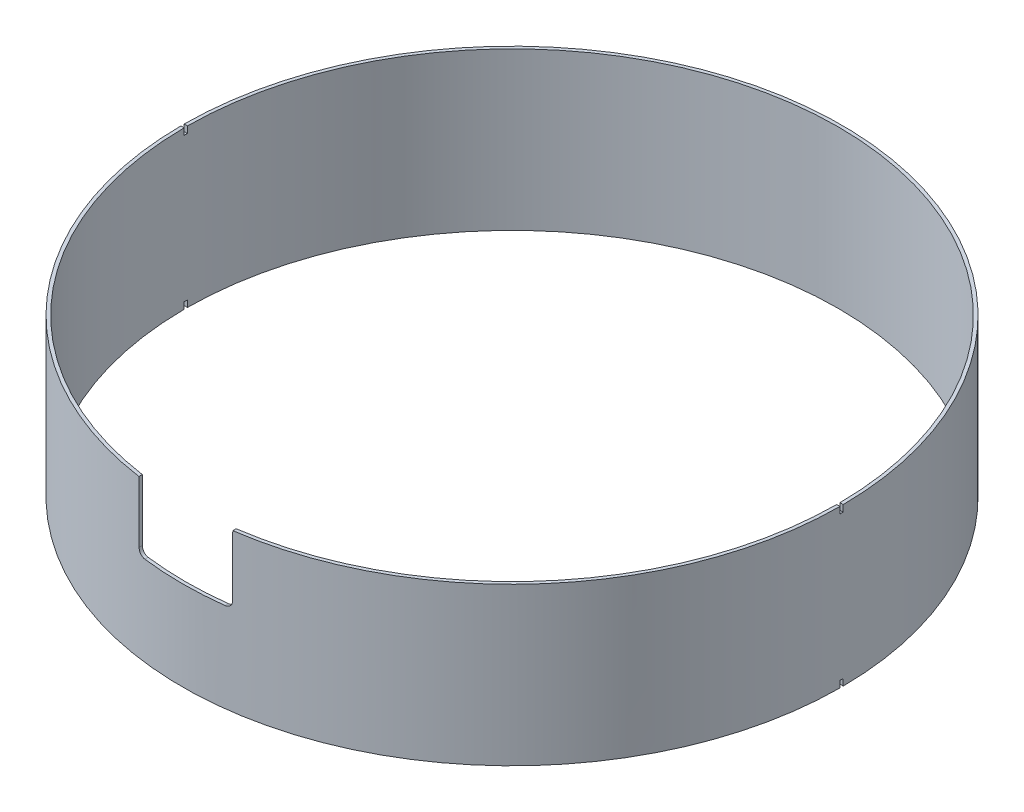
ISO-10303-21;
HEADER;
FILE_DESCRIPTION(('STEP AP214'),'2;1');
FILE_NAME('part.step','',(''),(''),'','','');
FILE_SCHEMA(('AUTOMOTIVE_DESIGN { 1 0 10303 214 1 1 1 1 }'));
ENDSEC;
DATA;
#1=APPLICATION_CONTEXT('core data for automotive mechanical design processes');
#2=APPLICATION_PROTOCOL_DEFINITION('international standard','automotive_design',2000,#1);
#3=PRODUCT_CONTEXT('',#1,'mechanical');
#4=PRODUCT('Part','Part','',(#3));
#5=PRODUCT_RELATED_PRODUCT_CATEGORY('part','',(#4));
#6=PRODUCT_DEFINITION_FORMATION('','',#4);
#7=PRODUCT_DEFINITION_CONTEXT('part definition',#1,'design');
#8=PRODUCT_DEFINITION('design','',#6,#7);
#9=PRODUCT_DEFINITION_SHAPE('','',#8);
#10=(LENGTH_UNIT() NAMED_UNIT(*) SI_UNIT(.MILLI.,.METRE.));
#11=(NAMED_UNIT(*) PLANE_ANGLE_UNIT() SI_UNIT($,.RADIAN.));
#12=(NAMED_UNIT(*) SI_UNIT($,.STERADIAN.) SOLID_ANGLE_UNIT());
#13=UNCERTAINTY_MEASURE_WITH_UNIT(LENGTH_MEASURE(1.E-05),#10,'distance_accuracy_value','');
#14=(GEOMETRIC_REPRESENTATION_CONTEXT(3) GLOBAL_UNCERTAINTY_ASSIGNED_CONTEXT((#13)) GLOBAL_UNIT_ASSIGNED_CONTEXT((#10,
#11,#12)) REPRESENTATION_CONTEXT('',''));
#15=CARTESIAN_POINT('',(0.,0.,0.));
#16=DIRECTION('',(0.,0.,1.));
#17=DIRECTION('',(1.,0.,0.));
#18=AXIS2_PLACEMENT_3D('',#15,#16,#17);
#19=CARTESIAN_POINT('',(0.,24.,0.));
#20=DIRECTION('',(0.,1.,0.));
#21=DIRECTION('',(0.,0.,1.));
#22=AXIS2_PLACEMENT_3D('',#19,#20,#21);
#23=PLANE('',#22);
#24=CARTESIAN_POINT('',(0.,24.,0.));
#25=DIRECTION('',(0.,1.,0.));
#26=DIRECTION('',(0.,0.,1.));
#27=AXIS2_PLACEMENT_3D('',#24,#25,#26);
#28=CIRCLE('',#27,50.3);
#29=CARTESIAN_POINT('',(7.15883579523689,24.,49.7879610955986));
#30=VERTEX_POINT('',#29);
#31=CARTESIAN_POINT('',(50.2993787237974,24.,0.25));
#32=VERTEX_POINT('',#31);
#33=EDGE_CURVE('E262',#30,#32,#28,.T.);
#34=ORIENTED_EDGE('',*,*,#33,.T.);
#35=DIRECTION('',(-1.,0.,0.));
#36=VECTOR('',#35,1.);
#37=CARTESIAN_POINT('',(52.,24.,0.25));
#38=LINE('',#37,#36);
#39=CARTESIAN_POINT('',(49.7993724860063,24.,0.25));
#40=VERTEX_POINT('',#39);
#41=EDGE_CURVE('E357',#32,#40,#38,.T.);
#42=ORIENTED_EDGE('',*,*,#41,.T.);
#43=CARTESIAN_POINT('',(0.,24.,0.));
#44=DIRECTION('',(0.,1.,0.));
#45=DIRECTION('',(0.,0.,1.));
#46=AXIS2_PLACEMENT_3D('',#43,#44,#45);
#47=CIRCLE('',#46,49.8);
#48=CARTESIAN_POINT('',(7.15883579523689,24.,49.2827664610747));
#49=VERTEX_POINT('',#48);
#50=EDGE_CURVE('E254',#49,#40,#47,.T.);
#51=ORIENTED_EDGE('',*,*,#50,.F.);
#52=DIRECTION('',(0.,0.,-1.));
#53=VECTOR('',#52,1.);
#54=CARTESIAN_POINT('',(7.15883579523689,24.,52.));
#55=LINE('',#54,#53);
#56=EDGE_CURVE('E240',#30,#49,#55,.T.);
#57=ORIENTED_EDGE('',*,*,#56,.F.);
#58=EDGE_LOOP('',(#34,#42,#51,#57));
#59=FACE_BOUND('',#58,.T.);
#60=ADVANCED_FACE('F33',(#59),#23,.T.);
#61=CARTESIAN_POINT('',(-49.7993724860063,24.,0.25));
#62=VERTEX_POINT('',#61);
#63=CARTESIAN_POINT('',(-7.15883579523689,24.,49.2827664610748));
#64=VERTEX_POINT('',#63);
#65=EDGE_CURVE('E258',#62,#64,#47,.T.);
#66=ORIENTED_EDGE('',*,*,#65,.F.);
#67=CARTESIAN_POINT('',(-50.2993787237974,24.,0.25));
#68=VERTEX_POINT('',#67);
#69=EDGE_CURVE('E366',#62,#68,#38,.T.);
#70=ORIENTED_EDGE('',*,*,#69,.T.);
#71=CARTESIAN_POINT('',(-7.15883579523689,24.,49.7879610955986));
#72=VERTEX_POINT('',#71);
#73=EDGE_CURVE('E267',#68,#72,#28,.T.);
#74=ORIENTED_EDGE('',*,*,#73,.T.);
#75=DIRECTION('',(0.,0.,-1.));
#76=VECTOR('',#75,1.);
#77=CARTESIAN_POINT('',(-7.15883579523689,24.,52.));
#78=LINE('',#77,#76);
#79=EDGE_CURVE('E243',#72,#64,#78,.T.);
#80=ORIENTED_EDGE('',*,*,#79,.T.);
#81=EDGE_LOOP('',(#66,#70,#74,#80));
#82=FACE_BOUND('',#81,.T.);
#83=ADVANCED_FACE('F422',(#82),#23,.T.);
#84=CARTESIAN_POINT('',(50.2993787237974,24.,-0.25));
#85=VERTEX_POINT('',#84);
#86=CARTESIAN_POINT('',(-50.2993787237974,24.,-0.25));
#87=VERTEX_POINT('',#86);
#88=EDGE_CURVE('E266',#85,#87,#28,.T.);
#89=ORIENTED_EDGE('',*,*,#88,.T.);
#90=DIRECTION('',(-1.,0.,0.));
#91=VECTOR('',#90,1.);
#92=CARTESIAN_POINT('',(52.,24.,-0.25));
#93=LINE('',#92,#91);
#94=CARTESIAN_POINT('',(-49.7993724860063,24.,-0.25));
#95=VERTEX_POINT('',#94);
#96=EDGE_CURVE('E414',#95,#87,#93,.T.);
#97=ORIENTED_EDGE('',*,*,#96,.F.);
#98=CARTESIAN_POINT('',(49.7993724860063,24.,-0.25));
#99=VERTEX_POINT('',#98);
#100=EDGE_CURVE('E257',#99,#95,#47,.T.);
#101=ORIENTED_EDGE('',*,*,#100,.F.);
#102=EDGE_CURVE('E412',#85,#99,#93,.T.);
#103=ORIENTED_EDGE('',*,*,#102,.F.);
#104=EDGE_LOOP('',(#89,#97,#101,#103));
#105=FACE_BOUND('',#104,.T.);
#106=ADVANCED_FACE('F411',(#105),#23,.T.);
#107=CARTESIAN_POINT('',(0.,24.,0.));
#108=DIRECTION('',(0.,-1.,0.));
#109=DIRECTION('',(0.,0.,-1.));
#110=AXIS2_PLACEMENT_3D('',#107,#108,#109);
#111=CYLINDRICAL_SURFACE('',#110,50.3);
#112=DIRECTION('',(0.,-1.,0.));
#113=VECTOR('',#112,1.);
#114=CARTESIAN_POINT('',(50.2993787237974,24.,-0.25));
#115=LINE('',#114,#113);
#116=CARTESIAN_POINT('',(50.2993787237974,0.,-0.25));
#117=VERTEX_POINT('',#116);
#118=CARTESIAN_POINT('',(50.2993787237974,1.00000000000001,-0.25));
#119=VERTEX_POINT('',#118);
#120=EDGE_CURVE('E226',#117,#119,#115,.F.);
#121=ORIENTED_EDGE('',*,*,#120,.F.);
#122=CARTESIAN_POINT('',(0.,0.,0.));
#123=DIRECTION('',(0.,1.,0.));
#124=DIRECTION('',(0.,0.,1.));
#125=AXIS2_PLACEMENT_3D('',#122,#123,#124);
#126=CIRCLE('',#125,50.3);
#127=CARTESIAN_POINT('',(-50.2993787237973,0.,-0.25));
#128=VERTEX_POINT('',#127);
#129=EDGE_CURVE('E269',#117,#128,#126,.T.);
#130=ORIENTED_EDGE('',*,*,#129,.T.);
#131=DIRECTION('',(0.,-1.,0.));
#132=VECTOR('',#131,1.);
#133=CARTESIAN_POINT('',(-50.2993787237974,24.,-0.25));
#134=LINE('',#133,#132);
#135=CARTESIAN_POINT('',(-50.2993787237974,1.00000000000001,-0.25));
#136=VERTEX_POINT('',#135);
#137=EDGE_CURVE('E228',#136,#128,#134,.T.);
#138=ORIENTED_EDGE('',*,*,#137,.F.);
#139=CARTESIAN_POINT('',(0.,1.00000000000001,0.));
#140=DIRECTION('',(0.,-1.,0.));
#141=DIRECTION('',(0.,0.,-1.));
#142=AXIS2_PLACEMENT_3D('',#139,#140,#141);
#143=CIRCLE('',#142,50.3);
#144=CARTESIAN_POINT('',(-50.2993787237973,1.00000000000001,0.25));
#145=VERTEX_POINT('',#144);
#146=EDGE_CURVE('E199',#145,#136,#143,.T.);
#147=ORIENTED_EDGE('',*,*,#146,.F.);
#148=DIRECTION('',(0.,-1.,0.));
#149=VECTOR('',#148,1.);
#150=CARTESIAN_POINT('',(-50.2993787237974,24.,0.25));
#151=LINE('',#150,#149);
#152=CARTESIAN_POINT('',(-50.2993787237973,0.,0.25));
#153=VERTEX_POINT('',#152);
#154=EDGE_CURVE('E216',#153,#145,#151,.F.);
#155=ORIENTED_EDGE('',*,*,#154,.F.);
#156=CARTESIAN_POINT('',(50.2993787237974,0.,0.25));
#157=VERTEX_POINT('',#156);
#158=EDGE_CURVE('E214',#153,#157,#126,.T.);
#159=ORIENTED_EDGE('',*,*,#158,.T.);
#160=DIRECTION('',(0.,-1.,0.));
#161=VECTOR('',#160,1.);
#162=CARTESIAN_POINT('',(50.2993787237974,24.,0.25));
#163=LINE('',#162,#161);
#164=CARTESIAN_POINT('',(50.2993787237974,1.00000000000001,0.25));
#165=VERTEX_POINT('',#164);
#166=EDGE_CURVE('E203',#165,#157,#163,.T.);
#167=ORIENTED_EDGE('',*,*,#166,.F.);
#168=EDGE_CURVE('E188',#119,#165,#143,.T.);
#169=ORIENTED_EDGE('',*,*,#168,.F.);
#170=EDGE_LOOP('',(#121,#130,#138,#147,#155,#159,#167,#169));
#171=FACE_BOUND('',#170,.T.);
#172=DIRECTION('',(0.,-1.,0.));
#173=VECTOR('',#172,1.);
#174=CARTESIAN_POINT('',(-50.2993787237974,24.,0.25));
#175=LINE('',#174,#173);
#176=CARTESIAN_POINT('',(-50.2993787237974,23.,0.25));
#177=VERTEX_POINT('',#176);
#178=EDGE_CURVE('E236',#177,#68,#175,.F.);
#179=ORIENTED_EDGE('',*,*,#178,.F.);
#180=CARTESIAN_POINT('',(0.,23.,0.));
#181=DIRECTION('',(0.,1.,0.));
#182=DIRECTION('',(0.,0.,1.));
#183=AXIS2_PLACEMENT_3D('',#180,#181,#182);
#184=CIRCLE('',#183,50.3);
#185=CARTESIAN_POINT('',(-50.2993787237973,23.,-0.25));
#186=VERTEX_POINT('',#185);
#187=EDGE_CURVE('E233',#186,#177,#184,.T.);
#188=ORIENTED_EDGE('',*,*,#187,.F.);
#189=DIRECTION('',(0.,-1.,0.));
#190=VECTOR('',#189,1.);
#191=CARTESIAN_POINT('',(-50.2993787237974,24.,-0.25));
#192=LINE('',#191,#190);
#193=EDGE_CURVE('E231',#87,#186,#192,.T.);
#194=ORIENTED_EDGE('',*,*,#193,.F.);
#195=ORIENTED_EDGE('',*,*,#88,.F.);
#196=DIRECTION('',(0.,-1.,0.));
#197=VECTOR('',#196,1.);
#198=CARTESIAN_POINT('',(50.2993787237974,24.,-0.25));
#199=LINE('',#198,#197);
#200=CARTESIAN_POINT('',(50.2993787237974,23.,-0.25));
#201=VERTEX_POINT('',#200);
#202=EDGE_CURVE('E198',#201,#85,#199,.F.);
#203=ORIENTED_EDGE('',*,*,#202,.F.);
#204=CARTESIAN_POINT('',(50.2993787237974,23.,0.25));
#205=VERTEX_POINT('',#204);
#206=EDGE_CURVE('E235',#205,#201,#184,.T.);
#207=ORIENTED_EDGE('',*,*,#206,.F.);
#208=DIRECTION('',(0.,-1.,0.));
#209=VECTOR('',#208,1.);
#210=CARTESIAN_POINT('',(50.2993787237974,24.,0.25));
#211=LINE('',#210,#209);
#212=EDGE_CURVE('E238',#32,#205,#211,.T.);
#213=ORIENTED_EDGE('',*,*,#212,.F.);
#214=ORIENTED_EDGE('',*,*,#33,.F.);
#215=CARTESIAN_POINT('',(0.,-2563.5000000009,0.));
#216=DIRECTION('',(-0.999996172708014,0.00276668923527711,0.));
#217=DIRECTION('',(-0.00276668923527711,-0.999996172708014,0.));
#218=AXIS2_PLACEMENT_3D('',#215,#216,#217);
#219=ELLIPSE('',#218,18180.5745866366,50.3);
#220=CARTESIAN_POINT('',(7.13295949728158,14.6472333107663,49.791674894606));
#221=VERTEX_POINT('',#220);
#222=EDGE_CURVE('E246',#221,#30,#219,.T.);
#223=ORIENTED_EDGE('',*,*,#222,.F.);
#224=CARTESIAN_POINT('',(7.13295949728158,14.6472333107647,49.791674894606));
#225=CARTESIAN_POINT('',(7.13288216838157,14.6192953652032,49.7916858359364));
#226=CARTESIAN_POINT('',(7.13163339942542,14.5913741967739,49.7918648810998));
#227=CARTESIAN_POINT('',(7.12680686770671,14.5357400547111,49.7925559946084));
#228=CARTESIAN_POINT('',(7.12322927029838,14.5080270664375,49.7930680393096));
#229=CARTESIAN_POINT('',(7.10904229938948,14.425563892205,49.7950962895735));
#230=CARTESIAN_POINT('',(7.09497831952542,14.371378977348,49.7971046813568));
#231=CARTESIAN_POINT('',(7.05805132663608,14.2661693018495,49.8023519026614));
#232=CARTESIAN_POINT('',(7.03518507642578,14.2151457118633,49.8055911848581));
#233=CARTESIAN_POINT('',(6.98132971377967,14.1176722159745,49.8131686608679));
#234=CARTESIAN_POINT('',(6.95034130205242,14.071221916004,49.8175067598836));
#235=CARTESIAN_POINT('',(6.88097200401484,13.983962959591,49.8271357063443));
#236=CARTESIAN_POINT('',(6.84255622488127,13.9431825587393,49.8324310428164));
#237=CARTESIAN_POINT('',(6.75951958640089,13.8686288051904,49.843762371775));
#238=CARTESIAN_POINT('',(6.71489733158593,13.8348570325853,49.8497985307926));
#239=CARTESIAN_POINT('',(6.62026697521863,13.7749562530851,49.86245444279));
#240=CARTESIAN_POINT('',(6.5702119674544,13.7489024768214,49.8690791711551));
#241=CARTESIAN_POINT('',(6.46648427141302,13.7055856042272,49.882635356416));
#242=CARTESIAN_POINT('',(6.41281343553415,13.6883180448956,49.8895666556388));
#243=CARTESIAN_POINT('',(6.3212015513518,13.6671449265106,49.9012404442117));
#244=CARTESIAN_POINT('',(6.28382018335256,13.6607202824872,49.9059618301));
#245=CARTESIAN_POINT('',(6.20862052842333,13.6521482732698,49.9153731891362));
#246=CARTESIAN_POINT('',(6.17080292948257,13.6499949086165,49.9200631971099));
#247=CARTESIAN_POINT('',(6.13296332457356,13.65,49.9247109241449));
#248=B_SPLINE_CURVE_WITH_KNOTS('',3,(#224,#225,#226,#227,#228,#229,#230,#231,#232,#233,#234,
#235,#236,#237,#238,#239,#240,#241,#242,#243,#244,#245,#246,#247),.UNSPECIFIED.,.F.,.F.,(4,2,2,
2,2,2,2,2,2,2,2,4),(0.,0.0837623990760629,0.167518851403592,0.334704437673014,0.501951568125108,
0.66918427471437,0.837222595765029,1.00529875992398,1.174963052879,1.34454107778872,
1.45898076738421,1.57325960030106),.UNSPECIFIED.);
#249=CARTESIAN_POINT('',(6.13296332457356,13.65,49.9247109241449));
#250=VERTEX_POINT('',#249);
#251=EDGE_CURVE('E318',#221,#250,#248,.T.);
#252=ORIENTED_EDGE('',*,*,#251,.T.);
#253=CARTESIAN_POINT('',(0.,13.65,0.));
#254=DIRECTION('',(0.,1.,0.));
#255=DIRECTION('',(0.,0.,1.));
#256=AXIS2_PLACEMENT_3D('',#253,#254,#255);
#257=CIRCLE('',#256,50.3);
#258=CARTESIAN_POINT('',(-6.13296332457355,13.65,49.9247109241449));
#259=VERTEX_POINT('',#258);
#260=EDGE_CURVE('E248',#259,#250,#257,.T.);
#261=ORIENTED_EDGE('',*,*,#260,.F.);
#262=CARTESIAN_POINT('',(-6.13296332457355,13.65,49.9247109241449));
#263=CARTESIAN_POINT('',(-6.189614730399,13.6499541673621,49.9177553940837));
#264=CARTESIAN_POINT('',(-6.24623963685681,13.6548113054868,49.9106978062792));
#265=CARTESIAN_POINT('',(-6.35783403805967,13.6739818001132,49.8966031638031));
#266=CARTESIAN_POINT('',(-6.41280452100273,13.6882893896935,49.8895660992365));
#267=CARTESIAN_POINT('',(-6.51958735558045,13.7260213177617,49.8757246605314));
#268=CARTESIAN_POINT('',(-6.57139810806658,13.749450229008,49.8689204049703));
#269=CARTESIAN_POINT('',(-6.67034476276868,13.8047597771978,49.8557818796779));
#270=CARTESIAN_POINT('',(-6.71748165874823,13.8366386121859,49.849447510111));
#271=CARTESIAN_POINT('',(-6.80562316727822,13.9078862040343,49.8374906304888));
#272=CARTESIAN_POINT('',(-6.8466422016458,13.9472368327165,49.8318664512437));
#273=CARTESIAN_POINT('',(-6.92148772006539,14.0323899898594,49.8215258565981));
#274=CARTESIAN_POINT('',(-6.95531292486671,14.0781936634366,49.8168096026645));
#275=CARTESIAN_POINT('',(-7.01451552394915,14.1745628948156,49.8085079281193));
#276=CARTESIAN_POINT('',(-7.03995639854038,14.2250887683362,49.8049140212922));
#277=CARTESIAN_POINT('',(-7.08197055973289,14.3297516112531,49.7989572841969));
#278=CARTESIAN_POINT('',(-7.09855045589779,14.3838858551041,49.7965935363656));
#279=CARTESIAN_POINT('',(-7.11783636776546,14.473215447964,49.7938395780496));
#280=CARTESIAN_POINT('',(-7.12341956838367,14.507803599874,49.7930408532697));
#281=CARTESIAN_POINT('',(-7.13093190505234,14.5773319830695,49.7919653683706));
#282=CARTESIAN_POINT('',(-7.13286628845584,14.6122716360015,49.791687858696));
#283=CARTESIAN_POINT('',(-7.13295949728156,14.6472333107647,49.791674894606));
#284=B_SPLINE_CURVE_WITH_KNOTS('',3,(#262,#263,#264,#265,#266,#267,#268,#269,#270,#271,#272,
#273,#274,#275,#276,#277,#278,#279,#280,#281,#282,#283),.UNSPECIFIED.,.F.,.F.,(4,2,2,2,2,2,2,2,
2,2,4),(0.,0.171004630869715,0.341905006369904,0.512891169274745,0.68384089848964,
0.854381047484181,1.02495149765873,1.19419913549601,1.36332035164202,1.46827472701164,
1.57307805239683),.UNSPECIFIED.);
#285=CARTESIAN_POINT('',(-7.13295949728156,14.6472333107637,49.791674894606));
#286=VERTEX_POINT('',#285);
#287=EDGE_CURVE('E11',#259,#286,#284,.T.);
#288=ORIENTED_EDGE('',*,*,#287,.T.);
#289=CARTESIAN_POINT('',(0.,-2563.49999999996,0.));
#290=DIRECTION('',(0.999996172708014,0.00276668923527812,0.));
#291=DIRECTION('',(0.00276668923527812,-0.999996172708014,0.));
#292=AXIS2_PLACEMENT_3D('',#289,#290,#291);
#293=ELLIPSE('',#292,18180.5745866299,50.3);
#294=EDGE_CURVE('E251',#72,#286,#293,.T.);
#295=ORIENTED_EDGE('',*,*,#294,.F.);
#296=ORIENTED_EDGE('',*,*,#73,.F.);
#297=EDGE_LOOP('',(#179,#188,#194,#195,#203,#207,#213,#214,#223,#252,#261,#288,#295,#296));
#298=FACE_BOUND('',#297,.T.);
#299=ADVANCED_FACE('F211',(#171,#298),#111,.T.);
#300=CARTESIAN_POINT('',(0.,24.,0.));
#301=DIRECTION('',(0.,-1.,0.));
#302=DIRECTION('',(0.,0.,-1.));
#303=AXIS2_PLACEMENT_3D('',#300,#301,#302);
#304=CYLINDRICAL_SURFACE('',#303,49.8);
#305=CARTESIAN_POINT('',(0.,0.,0.));
#306=DIRECTION('',(0.,1.,0.));
#307=DIRECTION('',(0.,0.,1.));
#308=AXIS2_PLACEMENT_3D('',#305,#306,#307);
#309=CIRCLE('',#308,49.8);
#310=CARTESIAN_POINT('',(49.7993724860063,0.,-0.25));
#311=VERTEX_POINT('',#310);
#312=CARTESIAN_POINT('',(-49.7993724860062,0.,-0.25));
#313=VERTEX_POINT('',#312);
#314=EDGE_CURVE('E261',#311,#313,#309,.T.);
#315=ORIENTED_EDGE('',*,*,#314,.F.);
#316=DIRECTION('',(0.,-1.,0.));
#317=VECTOR('',#316,1.);
#318=CARTESIAN_POINT('',(49.7993724860063,24.,-0.25));
#319=LINE('',#318,#317);
#320=CARTESIAN_POINT('',(49.7993724860063,1.00000000000001,-0.25));
#321=VERTEX_POINT('',#320);
#322=EDGE_CURVE('E215',#311,#321,#319,.F.);
#323=ORIENTED_EDGE('',*,*,#322,.T.);
#324=CARTESIAN_POINT('',(0.,1.00000000000001,0.));
#325=DIRECTION('',(0.,-1.,0.));
#326=DIRECTION('',(0.,0.,-1.));
#327=AXIS2_PLACEMENT_3D('',#324,#325,#326);
#328=CIRCLE('',#327,49.8);
#329=CARTESIAN_POINT('',(49.7993724860063,1.00000000000001,0.25));
#330=VERTEX_POINT('',#329);
#331=EDGE_CURVE('E286',#321,#330,#328,.T.);
#332=ORIENTED_EDGE('',*,*,#331,.T.);
#333=DIRECTION('',(0.,-1.,0.));
#334=VECTOR('',#333,1.);
#335=CARTESIAN_POINT('',(49.7993724860063,24.,0.25));
#336=LINE('',#335,#334);
#337=CARTESIAN_POINT('',(49.7993724860063,0.,0.25));
#338=VERTEX_POINT('',#337);
#339=EDGE_CURVE('E206',#330,#338,#336,.T.);
#340=ORIENTED_EDGE('',*,*,#339,.T.);
#341=CARTESIAN_POINT('',(-49.7993724860063,0.,0.25));
#342=VERTEX_POINT('',#341);
#343=EDGE_CURVE('E253',#342,#338,#309,.T.);
#344=ORIENTED_EDGE('',*,*,#343,.F.);
#345=DIRECTION('',(0.,-1.,0.));
#346=VECTOR('',#345,1.);
#347=CARTESIAN_POINT('',(-49.7993724860063,24.,0.25));
#348=LINE('',#347,#346);
#349=CARTESIAN_POINT('',(-49.7993724860062,1.00000000000001,0.25));
#350=VERTEX_POINT('',#349);
#351=EDGE_CURVE('E380',#342,#350,#348,.F.);
#352=ORIENTED_EDGE('',*,*,#351,.T.);
#353=CARTESIAN_POINT('',(-49.7993724860063,1.00000000000001,-0.25));
#354=VERTEX_POINT('',#353);
#355=EDGE_CURVE('E283',#350,#354,#328,.T.);
#356=ORIENTED_EDGE('',*,*,#355,.T.);
#357=DIRECTION('',(0.,-1.,0.));
#358=VECTOR('',#357,1.);
#359=CARTESIAN_POINT('',(-49.7993724860063,24.,-0.25));
#360=LINE('',#359,#358);
#361=EDGE_CURVE('E219',#354,#313,#360,.T.);
#362=ORIENTED_EDGE('',*,*,#361,.T.);
#363=EDGE_LOOP('',(#315,#323,#332,#340,#344,#352,#356,#362));
#364=FACE_BOUND('',#363,.T.);
#365=CARTESIAN_POINT('',(0.,23.,0.));
#366=DIRECTION('',(0.,1.,0.));
#367=DIRECTION('',(0.,0.,1.));
#368=AXIS2_PLACEMENT_3D('',#365,#366,#367);
#369=CIRCLE('',#368,49.8);
#370=CARTESIAN_POINT('',(-49.7993724860063,23.,-0.25));
#371=VERTEX_POINT('',#370);
#372=CARTESIAN_POINT('',(-49.7993724860063,23.,0.25));
#373=VERTEX_POINT('',#372);
#374=EDGE_CURVE('E294',#371,#373,#369,.T.);
#375=ORIENTED_EDGE('',*,*,#374,.T.);
#376=DIRECTION('',(0.,-1.,0.));
#377=VECTOR('',#376,1.);
#378=CARTESIAN_POINT('',(-49.7993724860063,24.,0.25));
#379=LINE('',#378,#377);
#380=EDGE_CURVE('E300',#373,#62,#379,.F.);
#381=ORIENTED_EDGE('',*,*,#380,.T.);
#382=ORIENTED_EDGE('',*,*,#65,.T.);
#383=CARTESIAN_POINT('',(0.,-2563.49999999996,0.));
#384=DIRECTION('',(0.999996172708014,0.00276668923527812,0.));
#385=DIRECTION('',(0.00276668923527812,-0.999996172708014,0.));
#386=AXIS2_PLACEMENT_3D('',#383,#384,#385);
#387=ELLIPSE('',#386,17999.8531692678,49.8);
#388=CARTESIAN_POINT('',(-7.13295949728157,14.6472333107694,49.2865183271261));
#389=VERTEX_POINT('',#388);
#390=EDGE_CURVE('E274',#64,#389,#387,.T.);
#391=ORIENTED_EDGE('',*,*,#390,.T.);
#392=CARTESIAN_POINT('',(-7.13295949728156,14.6472333107647,49.2865183271261));
#393=CARTESIAN_POINT('',(-7.13288218249532,14.6192993497913,49.2865293785736));
#394=CARTESIAN_POINT('',(-7.13163375540476,14.5913821662347,49.2867102093405));
#395=CARTESIAN_POINT('',(-7.12680858684973,14.5357560027685,49.2874082091072));
#396=CARTESIAN_POINT('',(-7.12323201178345,14.5080470081223,49.2879253540699));
#397=CARTESIAN_POINT('',(-7.10904921571499,14.4255961248407,49.2899737891165));
#398=CARTESIAN_POINT('',(-7.09498949463784,14.3714194848212,49.2920021503845));
#399=CARTESIAN_POINT('',(-7.05807430784041,14.2662261023245,49.2973014529976));
#400=CARTESIAN_POINT('',(-7.03521562620564,14.2152105231009,49.3005728486513));
#401=CARTESIAN_POINT('',(-6.98137896249896,14.1177518531615,49.3082253196686));
#402=CARTESIAN_POINT('',(-6.95040166586852,14.0713083768856,49.3126063013506));
#403=CARTESIAN_POINT('',(-6.88105490590669,13.98405667904,49.3223307599996));
#404=CARTESIAN_POINT('',(-6.84264986193265,13.9432772736577,49.3276788613404));
#405=CARTESIAN_POINT('',(-6.75963683653701,13.8687234593461,49.3391230356074));
#406=CARTESIAN_POINT('',(-6.71502745729995,13.8349506332594,49.3452192770504));
#407=CARTESIAN_POINT('',(-6.62041560200111,13.7750390242876,49.3580023450243));
#408=CARTESIAN_POINT('',(-6.57036529606887,13.7489769463935,49.3646942968078));
#409=CARTESIAN_POINT('',(-6.46664628338502,13.7056428668548,49.3783881398453));
#410=CARTESIAN_POINT('',(-6.41297942210725,13.6883664199285,49.3853898724056));
#411=CARTESIAN_POINT('',(-6.32134408140008,13.6671711220907,49.3971861381562));
#412=CARTESIAN_POINT('',(-6.28393493464533,13.6607366852454,49.4019593395066));
#413=CARTESIAN_POINT('',(-6.20867854978287,13.6521515725635,49.4114739997331));
#414=CARTESIAN_POINT('',(-6.17083200088731,13.6499948919442,49.4162154937796));
#415=CARTESIAN_POINT('',(-6.13296332457355,13.65,49.4209142050148));
#416=B_SPLINE_CURVE_WITH_KNOTS('',3,(#392,#393,#394,#395,#396,#397,#398,#399,#400,#401,#402,
#403,#404,#405,#406,#407,#408,#409,#410,#411,#412,#413,#414,#415),.UNSPECIFIED.,.F.,.F.,(4,2,2,
2,2,2,2,2,2,2,2,4),(0.,0.0837504468770538,0.167494908570437,0.334655529124752,0.501877302978679,
0.669084963115823,0.837114365598027,1.0051816860371,1.17486865449747,1.34446968049443,
1.45901458105914,1.57339857825682),.UNSPECIFIED.);
#417=CARTESIAN_POINT('',(-6.13296332457355,13.65,49.4209142050148));
#418=VERTEX_POINT('',#417);
#419=EDGE_CURVE('E46',#389,#418,#416,.T.);
#420=ORIENTED_EDGE('',*,*,#419,.T.);
#421=CARTESIAN_POINT('',(0.,13.65,0.));
#422=DIRECTION('',(0.,1.,0.));
#423=DIRECTION('',(0.,0.,1.));
#424=AXIS2_PLACEMENT_3D('',#421,#422,#423);
#425=CIRCLE('',#424,49.8);
#426=CARTESIAN_POINT('',(6.13296332457356,13.65,49.4209142050148));
#427=VERTEX_POINT('',#426);
#428=EDGE_CURVE('E271',#418,#427,#425,.T.);
#429=ORIENTED_EDGE('',*,*,#428,.T.);
#430=CARTESIAN_POINT('',(6.13296332457356,13.65,49.4209142050148));
#431=CARTESIAN_POINT('',(6.18962280787876,13.649954207931,49.4138867700659));
#432=CARTESIAN_POINT('',(6.24625553725586,13.6548126802643,49.4067562060229));
#433=CARTESIAN_POINT('',(6.35786513611143,13.6739884882293,49.3925157659195));
#434=CARTESIAN_POINT('',(6.41284298843365,13.6883000888712,49.3854058799393));
#435=CARTESIAN_POINT('',(6.51963978715393,13.7260427477756,49.3714211716104));
#436=CARTESIAN_POINT('',(6.5714571326404,13.7494783840427,49.3645464691522));
#437=CARTESIAN_POINT('',(6.67041578917844,13.804804321031,49.3512719265914));
#438=CARTESIAN_POINT('',(6.71755809755958,13.8366928131428,49.3448719852812));
#439=CARTESIAN_POINT('',(6.80570640785597,13.9079610737058,49.3327917340223));
#440=CARTESIAN_POINT('',(6.84672713339556,13.9473223325425,49.3271097025805));
#441=CARTESIAN_POINT('',(6.92157395783269,14.0324992569606,49.3166629597777));
#442=CARTESIAN_POINT('',(6.95539878081411,14.0783160647948,49.3118984111111));
#443=CARTESIAN_POINT('',(7.01459261354898,14.1747056541381,49.3035128613741));
#444=CARTESIAN_POINT('',(7.04002645826232,14.2252379036669,49.2998831040729));
#445=CARTESIAN_POINT('',(7.08202538011351,14.3299135954051,49.2938674683116));
#446=CARTESIAN_POINT('',(7.09859709326549,14.3840543013196,49.2914806591601));
#447=CARTESIAN_POINT('',(7.11786160146107,14.4733620021553,49.2887015504381));
#448=CARTESIAN_POINT('',(7.1234354163343,14.5079213253118,49.28789599439));
#449=CARTESIAN_POINT('',(7.13093517421878,14.5773912473127,49.2868113049947));
#450=CARTESIAN_POINT('',(7.13286635511283,14.6123012690916,49.2865314157736));
#451=CARTESIAN_POINT('',(7.13295949728157,14.6472333107647,49.2865183271261));
#452=B_SPLINE_CURVE_WITH_KNOTS('',3,(#430,#431,#432,#433,#434,#435,#436,#437,#438,#439,#440,
#441,#442,#443,#444,#445,#446,#447,#448,#449,#450,#451),.UNSPECIFIED.,.F.,.F.,(4,2,2,2,2,2,2,2,
2,2,4),(0.,0.17105506758393,0.342006455294996,0.513043729011775,0.684044436355956,
0.854626984053781,1.02523975283277,1.19450155652914,1.36363643792845,1.46850186456289,
1.57321638589232),.UNSPECIFIED.);
#453=CARTESIAN_POINT('',(7.13295949728157,14.6472333107641,49.2865183271261));
#454=VERTEX_POINT('',#453);
#455=EDGE_CURVE('E312',#427,#454,#452,.T.);
#456=ORIENTED_EDGE('',*,*,#455,.T.);
#457=CARTESIAN_POINT('',(0.,-2563.5000000009,0.));
#458=DIRECTION('',(-0.999996172708014,0.00276668923527711,0.));
#459=DIRECTION('',(-0.00276668923527711,-0.999996172708014,0.));
#460=AXIS2_PLACEMENT_3D('',#457,#458,#459);
#461=ELLIPSE('',#460,17999.8531692744,49.8);
#462=EDGE_CURVE('E265',#454,#49,#461,.T.);
#463=ORIENTED_EDGE('',*,*,#462,.T.);
#464=ORIENTED_EDGE('',*,*,#50,.T.);
#465=DIRECTION('',(0.,-1.,0.));
#466=VECTOR('',#465,1.);
#467=CARTESIAN_POINT('',(49.7993724860063,24.,0.25));
#468=LINE('',#467,#466);
#469=CARTESIAN_POINT('',(49.7993724860063,23.,0.25));
#470=VERTEX_POINT('',#469);
#471=EDGE_CURVE('E293',#40,#470,#468,.T.);
#472=ORIENTED_EDGE('',*,*,#471,.T.);
#473=CARTESIAN_POINT('',(49.7993724860063,23.,-0.25));
#474=VERTEX_POINT('',#473);
#475=EDGE_CURVE('E290',#470,#474,#369,.T.);
#476=ORIENTED_EDGE('',*,*,#475,.T.);
#477=DIRECTION('',(0.,-1.,0.));
#478=VECTOR('',#477,1.);
#479=CARTESIAN_POINT('',(49.7993724860063,24.,-0.25));
#480=LINE('',#479,#478);
#481=EDGE_CURVE('E287',#474,#99,#480,.F.);
#482=ORIENTED_EDGE('',*,*,#481,.T.);
#483=ORIENTED_EDGE('',*,*,#100,.T.);
#484=DIRECTION('',(0.,-1.,0.));
#485=VECTOR('',#484,1.);
#486=CARTESIAN_POINT('',(-49.7993724860063,24.,-0.25));
#487=LINE('',#486,#485);
#488=EDGE_CURVE('E297',#95,#371,#487,.T.);
#489=ORIENTED_EDGE('',*,*,#488,.T.);
#490=EDGE_LOOP('',(#375,#381,#382,#391,#420,#429,#456,#463,#464,#472,#476,#482,#483,#489));
#491=FACE_BOUND('',#490,.T.);
#492=ADVANCED_FACE('F324',(#364,#491),#304,.F.);
#493=CARTESIAN_POINT('',(0.,0.,0.));
#494=DIRECTION('',(0.,1.,0.));
#495=DIRECTION('',(0.,0.,1.));
#496=AXIS2_PLACEMENT_3D('',#493,#494,#495);
#497=PLANE('',#496);
#498=DIRECTION('',(1.,0.,0.));
#499=VECTOR('',#498,1.);
#500=CARTESIAN_POINT('',(0.,0.,-0.25));
#501=LINE('',#500,#499);
#502=EDGE_CURVE('E282',#128,#313,#501,.T.);
#503=ORIENTED_EDGE('',*,*,#502,.F.);
#504=ORIENTED_EDGE('',*,*,#129,.F.);
#505=EDGE_CURVE('E280',#311,#117,#501,.T.);
#506=ORIENTED_EDGE('',*,*,#505,.F.);
#507=ORIENTED_EDGE('',*,*,#314,.T.);
#508=EDGE_LOOP('',(#503,#504,#506,#507));
#509=FACE_BOUND('',#508,.T.);
#510=ADVANCED_FACE('F329',(#509),#497,.F.);
#511=DIRECTION('',(-1.,0.,0.));
#512=VECTOR('',#511,1.);
#513=CARTESIAN_POINT('',(0.,0.,0.25));
#514=LINE('',#513,#512);
#515=EDGE_CURVE('E279',#157,#338,#514,.T.);
#516=ORIENTED_EDGE('',*,*,#515,.F.);
#517=ORIENTED_EDGE('',*,*,#158,.F.);
#518=EDGE_CURVE('E277',#342,#153,#514,.T.);
#519=ORIENTED_EDGE('',*,*,#518,.F.);
#520=ORIENTED_EDGE('',*,*,#343,.T.);
#521=EDGE_LOOP('',(#516,#517,#519,#520));
#522=FACE_BOUND('',#521,.T.);
#523=ADVANCED_FACE('F386',(#522),#497,.F.);
#524=CARTESIAN_POINT('',(-7.13020045205594,13.65,52.));
#525=DIRECTION('',(0.999996172708014,0.00276668923527812,0.));
#526=DIRECTION('',(-0.00276668923527812,0.999996172708014,0.));
#527=AXIS2_PLACEMENT_3D('',#524,#525,#526);
#528=PLANE('',#527);
#529=ORIENTED_EDGE('',*,*,#294,.T.);
#530=DIRECTION('',(0.,0.,-1.));
#531=VECTOR('',#530,1.);
#532=CARTESIAN_POINT('',(-7.13295949728156,14.6472333107647,49.2869175493203));
#533=LINE('',#532,#531);
#534=EDGE_CURVE('E310',#286,#389,#533,.T.);
#535=ORIENTED_EDGE('',*,*,#534,.T.);
#536=ORIENTED_EDGE('',*,*,#390,.F.);
#537=ORIENTED_EDGE('',*,*,#79,.F.);
#538=EDGE_LOOP('',(#529,#535,#536,#537));
#539=FACE_BOUND('',#538,.T.);
#540=ADVANCED_FACE('F331',(#539),#528,.T.);
#541=CARTESIAN_POINT('',(7.13020045205595,13.65,52.));
#542=DIRECTION('',(0.,1.,0.));
#543=DIRECTION('',(0.,0.,1.));
#544=AXIS2_PLACEMENT_3D('',#541,#542,#543);
#545=PLANE('',#544);
#546=ORIENTED_EDGE('',*,*,#260,.T.);
#547=DIRECTION('',(0.,0.,-1.));
#548=VECTOR('',#547,1.);
#549=CARTESIAN_POINT('',(6.13296332457356,13.65,49.2869175493204));
#550=LINE('',#549,#548);
#551=EDGE_CURVE('E305',#250,#427,#550,.T.);
#552=ORIENTED_EDGE('',*,*,#551,.T.);
#553=ORIENTED_EDGE('',*,*,#428,.F.);
#554=DIRECTION('',(0.,0.,-1.));
#555=VECTOR('',#554,1.);
#556=CARTESIAN_POINT('',(-6.13296332457355,13.65,49.7920700665628));
#557=LINE('',#556,#555);
#558=EDGE_CURVE('E303',#418,#259,#557,.F.);
#559=ORIENTED_EDGE('',*,*,#558,.T.);
#560=EDGE_LOOP('',(#546,#552,#553,#559));
#561=FACE_BOUND('',#560,.T.);
#562=ADVANCED_FACE('F348',(#561),#545,.T.);
#563=CARTESIAN_POINT('',(7.15883579523689,24.,52.));
#564=DIRECTION('',(-0.999996172708014,0.00276668923527711,0.));
#565=DIRECTION('',(-0.00276668923527711,-0.999996172708014,0.));
#566=AXIS2_PLACEMENT_3D('',#563,#564,#565);
#567=PLANE('',#566);
#568=ORIENTED_EDGE('',*,*,#462,.F.);
#569=DIRECTION('',(0.,0.,-1.));
#570=VECTOR('',#569,1.);
#571=CARTESIAN_POINT('',(7.13295949728158,14.6472333107647,49.7920700665628));
#572=LINE('',#571,#570);
#573=EDGE_CURVE('E308',#454,#221,#572,.F.);
#574=ORIENTED_EDGE('',*,*,#573,.T.);
#575=ORIENTED_EDGE('',*,*,#222,.T.);
#576=ORIENTED_EDGE('',*,*,#56,.T.);
#577=EDGE_LOOP('',(#568,#574,#575,#576));
#578=FACE_BOUND('',#577,.T.);
#579=ADVANCED_FACE('F352',(#578),#567,.T.);
#580=CARTESIAN_POINT('',(52.,1.00000000000001,-0.25));
#581=DIRECTION('',(0.,0.,1.));
#582=DIRECTION('',(1.,0.,0.));
#583=AXIS2_PLACEMENT_3D('',#580,#581,#582);
#584=PLANE('',#583);
#585=ORIENTED_EDGE('',*,*,#137,.T.);
#586=ORIENTED_EDGE('',*,*,#502,.T.);
#587=ORIENTED_EDGE('',*,*,#361,.F.);
#588=DIRECTION('',(-1.,0.,0.));
#589=VECTOR('',#588,1.);
#590=CARTESIAN_POINT('',(52.,1.00000000000001,-0.25));
#591=LINE('',#590,#589);
#592=EDGE_CURVE('E207',#354,#136,#591,.T.);
#593=ORIENTED_EDGE('',*,*,#592,.T.);
#594=EDGE_LOOP('',(#585,#586,#587,#593));
#595=FACE_BOUND('',#594,.T.);
#596=ADVANCED_FACE('F397',(#595),#584,.T.);
#597=CARTESIAN_POINT('',(52.,0.,0.25));
#598=DIRECTION('',(0.,0.,-1.));
#599=DIRECTION('',(-1.,0.,0.));
#600=AXIS2_PLACEMENT_3D('',#597,#598,#599);
#601=PLANE('',#600);
#602=ORIENTED_EDGE('',*,*,#154,.T.);
#603=DIRECTION('',(-1.,0.,0.));
#604=VECTOR('',#603,1.);
#605=CARTESIAN_POINT('',(52.,1.00000000000001,0.25));
#606=LINE('',#605,#604);
#607=EDGE_CURVE('E208',#350,#145,#606,.T.);
#608=ORIENTED_EDGE('',*,*,#607,.F.);
#609=ORIENTED_EDGE('',*,*,#351,.F.);
#610=ORIENTED_EDGE('',*,*,#518,.T.);
#611=EDGE_LOOP('',(#602,#608,#609,#610));
#612=FACE_BOUND('',#611,.T.);
#613=ADVANCED_FACE('F388',(#612),#601,.T.);
#614=CARTESIAN_POINT('',(52.,1.00000000000001,0.25));
#615=DIRECTION('',(0.,-1.,0.));
#616=DIRECTION('',(0.,0.,-1.));
#617=AXIS2_PLACEMENT_3D('',#614,#615,#616);
#618=PLANE('',#617);
#619=ORIENTED_EDGE('',*,*,#146,.T.);
#620=ORIENTED_EDGE('',*,*,#592,.F.);
#621=ORIENTED_EDGE('',*,*,#355,.F.);
#622=ORIENTED_EDGE('',*,*,#607,.T.);
#623=EDGE_LOOP('',(#619,#620,#621,#622));
#624=FACE_BOUND('',#623,.T.);
#625=ADVANCED_FACE('F395',(#624),#618,.T.);
#626=ORIENTED_EDGE('',*,*,#168,.T.);
#627=EDGE_CURVE('E191',#165,#330,#606,.T.);
#628=ORIENTED_EDGE('',*,*,#627,.T.);
#629=ORIENTED_EDGE('',*,*,#331,.F.);
#630=EDGE_CURVE('E194',#119,#321,#591,.T.);
#631=ORIENTED_EDGE('',*,*,#630,.F.);
#632=EDGE_LOOP('',(#626,#628,#629,#631));
#633=FACE_BOUND('',#632,.T.);
#634=ADVANCED_FACE('F190',(#633),#618,.T.);
#635=ORIENTED_EDGE('',*,*,#120,.T.);
#636=ORIENTED_EDGE('',*,*,#630,.T.);
#637=ORIENTED_EDGE('',*,*,#322,.F.);
#638=ORIENTED_EDGE('',*,*,#505,.T.);
#639=EDGE_LOOP('',(#635,#636,#637,#638));
#640=FACE_BOUND('',#639,.T.);
#641=ADVANCED_FACE('F418',(#640),#584,.T.);
#642=ORIENTED_EDGE('',*,*,#166,.T.);
#643=ORIENTED_EDGE('',*,*,#515,.T.);
#644=ORIENTED_EDGE('',*,*,#339,.F.);
#645=ORIENTED_EDGE('',*,*,#627,.F.);
#646=EDGE_LOOP('',(#642,#643,#644,#645));
#647=FACE_BOUND('',#646,.T.);
#648=ADVANCED_FACE('F202',(#647),#601,.T.);
#649=CARTESIAN_POINT('',(52.,23.,-0.25));
#650=DIRECTION('',(0.,0.,1.));
#651=DIRECTION('',(1.,0.,0.));
#652=AXIS2_PLACEMENT_3D('',#649,#650,#651);
#653=PLANE('',#652);
#654=ORIENTED_EDGE('',*,*,#202,.T.);
#655=ORIENTED_EDGE('',*,*,#102,.T.);
#656=ORIENTED_EDGE('',*,*,#481,.F.);
#657=DIRECTION('',(-1.,0.,0.));
#658=VECTOR('',#657,1.);
#659=CARTESIAN_POINT('',(52.,23.,-0.25));
#660=LINE('',#659,#658);
#661=EDGE_CURVE('E372',#201,#474,#660,.T.);
#662=ORIENTED_EDGE('',*,*,#661,.F.);
#663=EDGE_LOOP('',(#654,#655,#656,#662));
#664=FACE_BOUND('',#663,.T.);
#665=ADVANCED_FACE('F462',(#664),#653,.T.);
#666=CARTESIAN_POINT('',(52.,23.,0.25));
#667=DIRECTION('',(0.,1.,0.));
#668=DIRECTION('',(0.,0.,1.));
#669=AXIS2_PLACEMENT_3D('',#666,#667,#668);
#670=PLANE('',#669);
#671=ORIENTED_EDGE('',*,*,#206,.T.);
#672=ORIENTED_EDGE('',*,*,#661,.T.);
#673=ORIENTED_EDGE('',*,*,#475,.F.);
#674=DIRECTION('',(-1.,0.,0.));
#675=VECTOR('',#674,1.);
#676=CARTESIAN_POINT('',(52.,23.,0.25));
#677=LINE('',#676,#675);
#678=EDGE_CURVE('E363',#205,#470,#677,.T.);
#679=ORIENTED_EDGE('',*,*,#678,.F.);
#680=EDGE_LOOP('',(#671,#672,#673,#679));
#681=FACE_BOUND('',#680,.T.);
#682=ADVANCED_FACE('F466',(#681),#670,.T.);
#683=CARTESIAN_POINT('',(52.,24.,0.25));
#684=DIRECTION('',(0.,0.,-1.));
#685=DIRECTION('',(-1.,0.,0.));
#686=AXIS2_PLACEMENT_3D('',#683,#684,#685);
#687=PLANE('',#686);
#688=ORIENTED_EDGE('',*,*,#212,.T.);
#689=ORIENTED_EDGE('',*,*,#678,.T.);
#690=ORIENTED_EDGE('',*,*,#471,.F.);
#691=ORIENTED_EDGE('',*,*,#41,.F.);
#692=EDGE_LOOP('',(#688,#689,#690,#691));
#693=FACE_BOUND('',#692,.T.);
#694=ADVANCED_FACE('F360',(#693),#687,.T.);
#695=ORIENTED_EDGE('',*,*,#178,.T.);
#696=ORIENTED_EDGE('',*,*,#69,.F.);
#697=ORIENTED_EDGE('',*,*,#380,.F.);
#698=EDGE_CURVE('E367',#373,#177,#677,.T.);
#699=ORIENTED_EDGE('',*,*,#698,.T.);
#700=EDGE_LOOP('',(#695,#696,#697,#699));
#701=FACE_BOUND('',#700,.T.);
#702=ADVANCED_FACE('F465',(#701),#687,.T.);
#703=ORIENTED_EDGE('',*,*,#187,.T.);
#704=ORIENTED_EDGE('',*,*,#698,.F.);
#705=ORIENTED_EDGE('',*,*,#374,.F.);
#706=EDGE_CURVE('E374',#371,#186,#660,.T.);
#707=ORIENTED_EDGE('',*,*,#706,.T.);
#708=EDGE_LOOP('',(#703,#704,#705,#707));
#709=FACE_BOUND('',#708,.T.);
#710=ADVANCED_FACE('F469',(#709),#670,.T.);
#711=ORIENTED_EDGE('',*,*,#193,.T.);
#712=ORIENTED_EDGE('',*,*,#706,.F.);
#713=ORIENTED_EDGE('',*,*,#488,.F.);
#714=ORIENTED_EDGE('',*,*,#96,.T.);
#715=EDGE_LOOP('',(#711,#712,#713,#714));
#716=FACE_BOUND('',#715,.T.);
#717=ADVANCED_FACE('F428',(#716),#653,.T.);
#718=CARTESIAN_POINT('',(6.13296332457356,14.65,52.));
#719=DIRECTION('',(0.,0.,1.));
#720=DIRECTION('',(1.,0.,0.));
#721=AXIS2_PLACEMENT_3D('',#718,#719,#720);
#722=CYLINDRICAL_SURFACE('',#721,1.);
#723=ORIENTED_EDGE('',*,*,#251,.F.);
#724=ORIENTED_EDGE('',*,*,#573,.F.);
#725=ORIENTED_EDGE('',*,*,#455,.F.);
#726=ORIENTED_EDGE('',*,*,#551,.F.);
#727=EDGE_LOOP('',(#723,#724,#725,#726));
#728=FACE_BOUND('',#727,.T.);
#729=ADVANCED_FACE('F322',(#728),#722,.F.);
#730=CARTESIAN_POINT('',(-6.13296332457355,14.65,52.));
#731=DIRECTION('',(0.,0.,1.));
#732=DIRECTION('',(1.,0.,0.));
#733=AXIS2_PLACEMENT_3D('',#730,#731,#732);
#734=CYLINDRICAL_SURFACE('',#733,1.);
#735=ORIENTED_EDGE('',*,*,#287,.F.);
#736=ORIENTED_EDGE('',*,*,#558,.F.);
#737=ORIENTED_EDGE('',*,*,#419,.F.);
#738=ORIENTED_EDGE('',*,*,#534,.F.);
#739=EDGE_LOOP('',(#735,#736,#737,#738));
#740=FACE_BOUND('',#739,.T.);
#741=ADVANCED_FACE('F35',(#740),#734,.F.);
#742=CLOSED_SHELL('',(#60,#83,#106,#299,#492,#510,#523,#540,#562,#579,#596,#613,#625,#634,#641,
#648,#665,#682,#694,#702,#710,#717,#729,#741));
#743=MANIFOLD_SOLID_BREP('B2',#742);
#744=ADVANCED_BREP_SHAPE_REPRESENTATION('',(#18,#743),#14);
#745=SHAPE_DEFINITION_REPRESENTATION(#9,#744);
ENDSEC;
END-ISO-10303-21;
